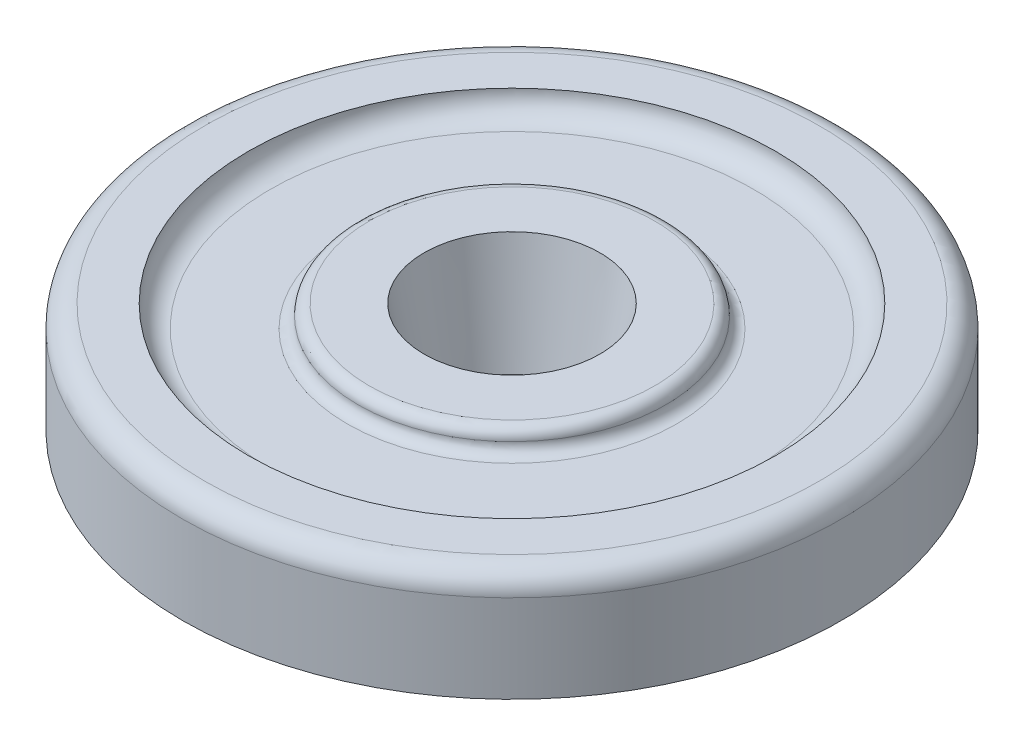
ISO-10303-21;
HEADER;
FILE_DESCRIPTION(('STEP AP214'),'2;1');
FILE_NAME('part.step','',(''),(''),'','','');
FILE_SCHEMA(('AUTOMOTIVE_DESIGN { 1 0 10303 214 1 1 1 1 }'));
ENDSEC;
DATA;
#1=APPLICATION_CONTEXT('core data for automotive mechanical design processes');
#2=APPLICATION_PROTOCOL_DEFINITION('international standard','automotive_design',2000,#1);
#3=PRODUCT_CONTEXT('',#1,'mechanical');
#4=PRODUCT('Part','Part','',(#3));
#5=PRODUCT_RELATED_PRODUCT_CATEGORY('part','',(#4));
#6=PRODUCT_DEFINITION_FORMATION('','',#4);
#7=PRODUCT_DEFINITION_CONTEXT('part definition',#1,'design');
#8=PRODUCT_DEFINITION('design','',#6,#7);
#9=PRODUCT_DEFINITION_SHAPE('','',#8);
#10=(LENGTH_UNIT() NAMED_UNIT(*) SI_UNIT(.MILLI.,.METRE.));
#11=(NAMED_UNIT(*) PLANE_ANGLE_UNIT() SI_UNIT($,.RADIAN.));
#12=(NAMED_UNIT(*) SI_UNIT($,.STERADIAN.) SOLID_ANGLE_UNIT());
#13=UNCERTAINTY_MEASURE_WITH_UNIT(LENGTH_MEASURE(1.E-05),#10,'distance_accuracy_value','');
#14=(GEOMETRIC_REPRESENTATION_CONTEXT(3) GLOBAL_UNCERTAINTY_ASSIGNED_CONTEXT((#13)) GLOBAL_UNIT_ASSIGNED_CONTEXT((#10,
#11,#12)) REPRESENTATION_CONTEXT('',''));
#15=CARTESIAN_POINT('',(0.,0.,0.));
#16=DIRECTION('',(0.,0.,1.));
#17=DIRECTION('',(1.,0.,0.));
#18=AXIS2_PLACEMENT_3D('',#15,#16,#17);
#19=CARTESIAN_POINT('',(0.,5.,0.));
#20=DIRECTION('',(0.,1.,0.));
#21=DIRECTION('',(0.,0.,1.));
#22=AXIS2_PLACEMENT_3D('',#19,#20,#21);
#23=PLANE('',#22);
#24=CARTESIAN_POINT('',(0.,5.,0.));
#25=DIRECTION('',(0.,1.,0.));
#26=DIRECTION('',(0.,0.,1.));
#27=AXIS2_PLACEMENT_3D('',#24,#25,#26);
#28=CIRCLE('',#27,6.5);
#29=CARTESIAN_POINT('',(0.,5.,6.5));
#30=VERTEX_POINT('',#29);
#31=EDGE_CURVE('E10',#30,#30,#28,.T.);
#32=ORIENTED_EDGE('',*,*,#31,.T.);
#33=EDGE_LOOP('',(#32));
#34=FACE_BOUND('',#33,.T.);
#35=CARTESIAN_POINT('',(0.,5.,0.));
#36=DIRECTION('',(0.,1.,0.));
#37=DIRECTION('',(0.,0.,1.));
#38=AXIS2_PLACEMENT_3D('',#35,#36,#37);
#39=CIRCLE('',#38,4.00426181239612);
#40=CARTESIAN_POINT('',(0.,5.,4.00426181239612));
#41=VERTEX_POINT('',#40);
#42=EDGE_CURVE('E51',#41,#41,#39,.F.);
#43=ORIENTED_EDGE('',*,*,#42,.T.);
#44=EDGE_LOOP('',(#43));
#45=FACE_BOUND('',#44,.T.);
#46=ADVANCED_FACE('F43',(#34,#45),#23,.T.);
#47=CARTESIAN_POINT('',(0.,5.,0.));
#48=DIRECTION('',(0.,1.,0.));
#49=DIRECTION('',(0.,0.,1.));
#50=AXIS2_PLACEMENT_3D('',#47,#48,#49);
#51=CIRCLE('',#50,14.);
#52=CARTESIAN_POINT('',(0.,5.,14.));
#53=VERTEX_POINT('',#52);
#54=EDGE_CURVE('E75',#53,#53,#51,.T.);
#55=ORIENTED_EDGE('',*,*,#54,.T.);
#56=EDGE_LOOP('',(#55));
#57=FACE_BOUND('',#56,.T.);
#58=CARTESIAN_POINT('',(0.,5.,0.));
#59=DIRECTION('',(0.,1.,0.));
#60=DIRECTION('',(0.,0.,1.));
#61=AXIS2_PLACEMENT_3D('',#58,#59,#60);
#62=CIRCLE('',#61,12.);
#63=CARTESIAN_POINT('',(0.,5.,12.));
#64=VERTEX_POINT('',#63);
#65=EDGE_CURVE('E91',#64,#64,#62,.T.);
#66=ORIENTED_EDGE('',*,*,#65,.F.);
#67=EDGE_LOOP('',(#66));
#68=FACE_BOUND('',#67,.T.);
#69=ADVANCED_FACE('F99',(#57,#68),#23,.T.);
#70=CARTESIAN_POINT('',(0.,0.,0.));
#71=DIRECTION('',(0.,1.,0.));
#72=DIRECTION('',(0.,0.,1.));
#73=AXIS2_PLACEMENT_3D('',#70,#71,#72);
#74=PLANE('',#73);
#75=CARTESIAN_POINT('',(0.,0.,0.));
#76=DIRECTION('',(0.,1.,0.));
#77=DIRECTION('',(0.,0.,1.));
#78=AXIS2_PLACEMENT_3D('',#75,#76,#77);
#79=CIRCLE('',#78,3.12010153698833);
#80=CARTESIAN_POINT('',(0.,0.,3.12010153698833));
#81=VERTEX_POINT('',#80);
#82=EDGE_CURVE('E87',#81,#81,#79,.T.);
#83=ORIENTED_EDGE('',*,*,#82,.T.);
#84=EDGE_LOOP('',(#83));
#85=FACE_BOUND('',#84,.T.);
#86=CARTESIAN_POINT('',(0.,0.,0.));
#87=DIRECTION('',(0.,1.,0.));
#88=DIRECTION('',(0.,0.,1.));
#89=AXIS2_PLACEMENT_3D('',#86,#87,#88);
#90=CIRCLE('',#89,15.);
#91=CARTESIAN_POINT('',(0.,0.,15.));
#92=VERTEX_POINT('',#91);
#93=EDGE_CURVE('E83',#92,#92,#90,.T.);
#94=ORIENTED_EDGE('',*,*,#93,.F.);
#95=EDGE_LOOP('',(#94));
#96=FACE_BOUND('',#95,.T.);
#97=ADVANCED_FACE('F101',(#85,#96),#74,.F.);
#98=CARTESIAN_POINT('',(0.,5.,0.));
#99=DIRECTION('',(0.,-1.,0.));
#100=DIRECTION('',(0.,0.,-1.));
#101=AXIS2_PLACEMENT_3D('',#98,#99,#100);
#102=CYLINDRICAL_SURFACE('',#101,15.);
#103=CARTESIAN_POINT('',(0.,4.,0.));
#104=DIRECTION('',(0.,1.,0.));
#105=DIRECTION('',(0.,0.,1.));
#106=AXIS2_PLACEMENT_3D('',#103,#104,#105);
#107=CIRCLE('',#106,15.);
#108=CARTESIAN_POINT('',(0.,4.,15.));
#109=VERTEX_POINT('',#108);
#110=EDGE_CURVE('E71',#109,#109,#107,.F.);
#111=ORIENTED_EDGE('',*,*,#110,.T.);
#112=EDGE_LOOP('',(#111));
#113=FACE_BOUND('',#112,.T.);
#114=ORIENTED_EDGE('',*,*,#93,.T.);
#115=EDGE_LOOP('',(#114));
#116=FACE_BOUND('',#115,.T.);
#117=ADVANCED_FACE('F109',(#113,#116),#102,.T.);
#118=CARTESIAN_POINT('',(0.,4.99998266641518,0.));
#119=DIRECTION('',(0.,1.,0.));
#120=DIRECTION('',(-1.,0.,0.));
#121=AXIS2_PLACEMENT_3D('',#118,#119,#120);
#122=CONICAL_SURFACE('',#121,4.00009848627741,0.174215786442944);
#123=CARTESIAN_POINT('',(0.,4.99998266641518,0.));
#124=DIRECTION('',(0.,1.,0.));
#125=DIRECTION('',(-1.,0.,0.));
#126=AXIS2_PLACEMENT_3D('',#123,#124,#125);
#127=CIRCLE('',#126,4.00009848627741);
#128=CARTESIAN_POINT('',(-4.00009848627741,4.99998266641518,0.));
#129=VERTEX_POINT('',#128);
#130=EDGE_CURVE('E79',#129,#129,#127,.T.);
#131=ORIENTED_EDGE('',*,*,#130,.T.);
#132=EDGE_LOOP('',(#131));
#133=FACE_BOUND('',#132,.T.);
#134=ORIENTED_EDGE('',*,*,#82,.F.);
#135=EDGE_LOOP('',(#134));
#136=FACE_BOUND('',#135,.T.);
#137=ADVANCED_FACE('F115',(#133,#136),#122,.F.);
#138=CARTESIAN_POINT('',(0.,4.,0.));
#139=DIRECTION('',(0.,1.,0.));
#140=DIRECTION('',(0.,0.,1.));
#141=AXIS2_PLACEMENT_3D('',#138,#139,#140);
#142=PLANE('',#141);
#143=CARTESIAN_POINT('',(0.,4.,0.));
#144=DIRECTION('',(0.,1.,0.));
#145=DIRECTION('',(0.,0.,1.));
#146=AXIS2_PLACEMENT_3D('',#143,#144,#145);
#147=CIRCLE('',#146,7.5);
#148=CARTESIAN_POINT('',(0.,4.,7.5));
#149=VERTEX_POINT('',#148);
#150=EDGE_CURVE('E56',#149,#149,#147,.F.);
#151=ORIENTED_EDGE('',*,*,#150,.T.);
#152=EDGE_LOOP('',(#151));
#153=FACE_BOUND('',#152,.T.);
#154=CARTESIAN_POINT('',(0.,4.,0.));
#155=DIRECTION('',(0.,1.,0.));
#156=DIRECTION('',(0.,0.,1.));
#157=AXIS2_PLACEMENT_3D('',#154,#155,#156);
#158=CIRCLE('',#157,11.);
#159=CARTESIAN_POINT('',(0.,4.,11.));
#160=VERTEX_POINT('',#159);
#161=EDGE_CURVE('E67',#160,#160,#158,.T.);
#162=ORIENTED_EDGE('',*,*,#161,.T.);
#163=EDGE_LOOP('',(#162));
#164=FACE_BOUND('',#163,.T.);
#165=ADVANCED_FACE('F119',(#153,#164),#142,.T.);
#166=CARTESIAN_POINT('',(0.,4.,0.));
#167=DIRECTION('',(0.,1.,0.));
#168=DIRECTION('',(0.,0.,1.));
#169=AXIS2_PLACEMENT_3D('',#166,#167,#168);
#170=TOROIDAL_SURFACE('',#169,14.,1.);
#171=ORIENTED_EDGE('',*,*,#110,.F.);
#172=EDGE_LOOP('',(#171));
#173=FACE_BOUND('',#172,.T.);
#174=ORIENTED_EDGE('',*,*,#54,.F.);
#175=EDGE_LOOP('',(#174));
#176=FACE_BOUND('',#175,.T.);
#177=ADVANCED_FACE('F116',(#173,#176),#170,.T.);
#178=CARTESIAN_POINT('',(0.,5.,0.));
#179=DIRECTION('',(0.,1.,0.));
#180=DIRECTION('',(0.,0.,1.));
#181=AXIS2_PLACEMENT_3D('',#178,#179,#180);
#182=TOROIDAL_SURFACE('',#181,11.,1.);
#183=ORIENTED_EDGE('',*,*,#65,.T.);
#184=EDGE_LOOP('',(#183));
#185=FACE_BOUND('',#184,.T.);
#186=ORIENTED_EDGE('',*,*,#161,.F.);
#187=EDGE_LOOP('',(#186));
#188=FACE_BOUND('',#187,.T.);
#189=ADVANCED_FACE('F96',(#185,#188),#182,.F.);
#190=CARTESIAN_POINT('',(0.,4.5,0.));
#191=DIRECTION('',(0.,1.,0.));
#192=DIRECTION('',(0.,0.,1.));
#193=AXIS2_PLACEMENT_3D('',#190,#191,#192);
#194=TOROIDAL_SURFACE('',#193,7.5,0.5);
#195=ORIENTED_EDGE('',*,*,#150,.F.);
#196=EDGE_LOOP('',(#195));
#197=FACE_BOUND('',#196,.T.);
#198=CARTESIAN_POINT('',(0.,4.5,0.));
#199=DIRECTION('',(0.,1.,0.));
#200=DIRECTION('',(0.,0.,1.));
#201=AXIS2_PLACEMENT_3D('',#198,#199,#200);
#202=CIRCLE('',#201,7.);
#203=CARTESIAN_POINT('',(0.,4.5,7.));
#204=VERTEX_POINT('',#203);
#205=EDGE_CURVE('E61',#204,#204,#202,.T.);
#206=ORIENTED_EDGE('',*,*,#205,.F.);
#207=EDGE_LOOP('',(#206));
#208=FACE_BOUND('',#207,.T.);
#209=ADVANCED_FACE('F123',(#197,#208),#194,.F.);
#210=CARTESIAN_POINT('',(0.,4.5,0.));
#211=DIRECTION('',(0.,1.,0.));
#212=DIRECTION('',(0.,0.,1.));
#213=AXIS2_PLACEMENT_3D('',#210,#211,#212);
#214=TOROIDAL_SURFACE('',#213,6.5,0.5);
#215=ORIENTED_EDGE('',*,*,#205,.T.);
#216=EDGE_LOOP('',(#215));
#217=FACE_BOUND('',#216,.T.);
#218=ORIENTED_EDGE('',*,*,#31,.F.);
#219=EDGE_LOOP('',(#218));
#220=FACE_BOUND('',#219,.T.);
#221=ADVANCED_FACE('F125',(#217,#220),#214,.T.);
#222=CARTESIAN_POINT('',(0.,4.5,0.));
#223=DIRECTION('',(0.,1.,0.));
#224=DIRECTION('',(0.,0.,1.));
#225=AXIS2_PLACEMENT_3D('',#222,#223,#224);
#226=TOROIDAL_SURFACE('',#225,4.00426181239612,0.5);
#227=ORIENTED_EDGE('',*,*,#42,.F.);
#228=EDGE_LOOP('',(#227));
#229=FACE_BOUND('',#228,.T.);
#230=ORIENTED_EDGE('',*,*,#130,.F.);
#231=EDGE_LOOP('',(#230));
#232=FACE_BOUND('',#231,.T.);
#233=ADVANCED_FACE('F45',(#229,#232),#226,.T.);
#234=CLOSED_SHELL('',(#46,#69,#97,#117,#137,#165,#177,#189,#209,#221,#233));
#235=MANIFOLD_SOLID_BREP('B2',#234);
#236=ADVANCED_BREP_SHAPE_REPRESENTATION('',(#18,#235),#14);
#237=SHAPE_DEFINITION_REPRESENTATION(#9,#236);
ENDSEC;
END-ISO-10303-21;
